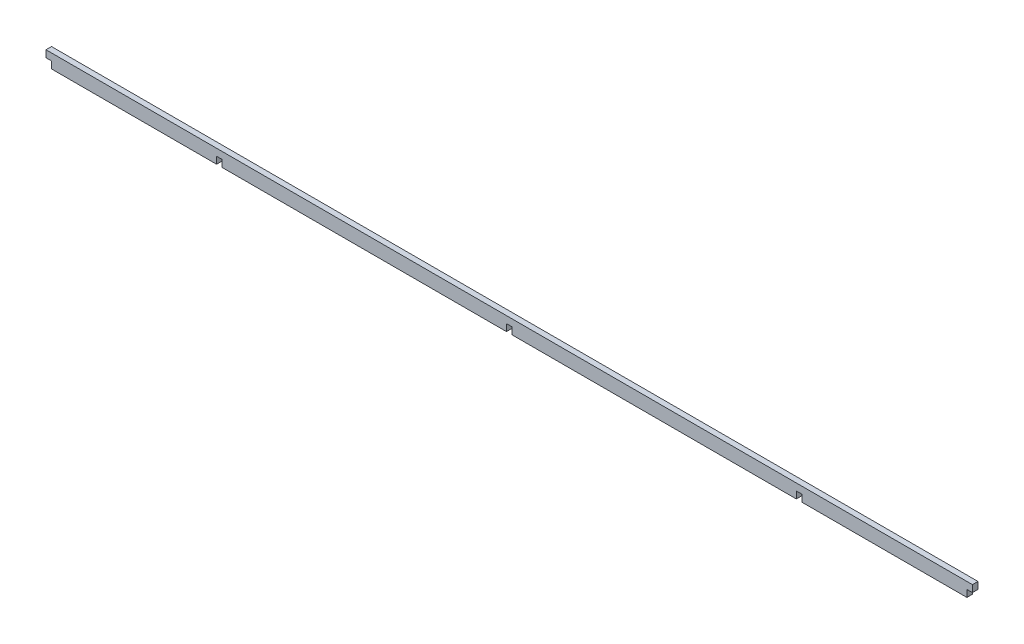
ISO-10303-21;
HEADER;
FILE_DESCRIPTION(('STEP AP214'),'2;1');
FILE_NAME('part.step','',(''),(''),'','','');
FILE_SCHEMA(('AUTOMOTIVE_DESIGN { 1 0 10303 214 1 1 1 1 }'));
ENDSEC;
DATA;
#1=APPLICATION_CONTEXT('core data for automotive mechanical design processes');
#2=APPLICATION_PROTOCOL_DEFINITION('international standard','automotive_design',2000,#1);
#3=PRODUCT_CONTEXT('',#1,'mechanical');
#4=PRODUCT('Part','Part','',(#3));
#5=PRODUCT_RELATED_PRODUCT_CATEGORY('part','',(#4));
#6=PRODUCT_DEFINITION_FORMATION('','',#4);
#7=PRODUCT_DEFINITION_CONTEXT('part definition',#1,'design');
#8=PRODUCT_DEFINITION('design','',#6,#7);
#9=PRODUCT_DEFINITION_SHAPE('','',#8);
#10=(LENGTH_UNIT() NAMED_UNIT(*) SI_UNIT(.MILLI.,.METRE.));
#11=(NAMED_UNIT(*) PLANE_ANGLE_UNIT() SI_UNIT($,.RADIAN.));
#12=(NAMED_UNIT(*) SI_UNIT($,.STERADIAN.) SOLID_ANGLE_UNIT());
#13=UNCERTAINTY_MEASURE_WITH_UNIT(LENGTH_MEASURE(1.E-05),#10,'distance_accuracy_value','');
#14=(GEOMETRIC_REPRESENTATION_CONTEXT(3) GLOBAL_UNCERTAINTY_ASSIGNED_CONTEXT((#13)) GLOBAL_UNIT_ASSIGNED_CONTEXT((#10,
#11,#12)) REPRESENTATION_CONTEXT('',''));
#15=CARTESIAN_POINT('',(0.,0.,0.));
#16=DIRECTION('',(0.,0.,1.));
#17=DIRECTION('',(1.,0.,0.));
#18=AXIS2_PLACEMENT_3D('',#15,#16,#17);
#19=CARTESIAN_POINT('',(825.000000000002,-7.32747196252598E-12,10.));
#20=DIRECTION('',(1.,0.,0.));
#21=DIRECTION('',(0.,1.,0.));
#22=AXIS2_PLACEMENT_3D('',#19,#20,#21);
#23=PLANE('',#22);
#24=DIRECTION('',(0.,-1.,0.));
#25=VECTOR('',#24,1.);
#26=CARTESIAN_POINT('',(825.000000000002,-7.32747196252598E-12,0.));
#27=LINE('',#26,#25);
#28=CARTESIAN_POINT('',(825.000000000002,2.02737259969958E-13,0.));
#29=VERTEX_POINT('',#28);
#30=CARTESIAN_POINT('',(825.000000000002,-12.5,0.));
#31=VERTEX_POINT('',#30);
#32=EDGE_CURVE('E207',#29,#31,#27,.T.);
#33=ORIENTED_EDGE('',*,*,#32,.F.);
#34=DIRECTION('',(0.,0.,-1.));
#35=VECTOR('',#34,1.);
#36=CARTESIAN_POINT('',(825.000000000002,2.02737259969958E-13,10.));
#37=LINE('',#36,#35);
#38=CARTESIAN_POINT('',(825.000000000002,2.02737259969958E-13,10.));
#39=VERTEX_POINT('',#38);
#40=EDGE_CURVE('E11',#39,#29,#37,.T.);
#41=ORIENTED_EDGE('',*,*,#40,.F.);
#42=DIRECTION('',(0.,-1.,0.));
#43=VECTOR('',#42,1.);
#44=CARTESIAN_POINT('',(825.000000000002,-7.32747196252598E-12,10.));
#45=LINE('',#44,#43);
#46=CARTESIAN_POINT('',(825.000000000002,-12.5,10.));
#47=VERTEX_POINT('',#46);
#48=EDGE_CURVE('E315',#39,#47,#45,.T.);
#49=ORIENTED_EDGE('',*,*,#48,.T.);
#50=DIRECTION('',(0.,0.,-1.));
#51=VECTOR('',#50,1.);
#52=CARTESIAN_POINT('',(825.000000000002,-12.5,10.));
#53=LINE('',#52,#51);
#54=EDGE_CURVE('E129',#47,#31,#53,.T.);
#55=ORIENTED_EDGE('',*,*,#54,.T.);
#56=EDGE_LOOP('',(#33,#41,#49,#55));
#57=FACE_BOUND('',#56,.T.);
#58=ADVANCED_FACE('F43',(#57),#23,.T.);
#59=CARTESIAN_POINT('',(0.,0.,10.));
#60=DIRECTION('',(0.,-1.,0.));
#61=DIRECTION('',(1.,0.,0.));
#62=AXIS2_PLACEMENT_3D('',#59,#60,#61);
#63=PLANE('',#62);
#64=DIRECTION('',(-1.,0.,0.));
#65=VECTOR('',#64,1.);
#66=CARTESIAN_POINT('',(0.,0.,0.));
#67=LINE('',#66,#65);
#68=CARTESIAN_POINT('',(835.,2.03626637713783E-13,0.));
#69=VERTEX_POINT('',#68);
#70=EDGE_CURVE('E210',#69,#29,#67,.T.);
#71=ORIENTED_EDGE('',*,*,#70,.F.);
#72=DIRECTION('',(0.,0.,-1.));
#73=VECTOR('',#72,1.);
#74=CARTESIAN_POINT('',(835.,2.03626637713783E-13,10.));
#75=LINE('',#74,#73);
#76=CARTESIAN_POINT('',(835.,2.03626637713783E-13,10.));
#77=VERTEX_POINT('',#76);
#78=EDGE_CURVE('E51',#77,#69,#75,.T.);
#79=ORIENTED_EDGE('',*,*,#78,.F.);
#80=DIRECTION('',(-1.,0.,0.));
#81=VECTOR('',#80,1.);
#82=CARTESIAN_POINT('',(0.,0.,10.));
#83=LINE('',#82,#81);
#84=EDGE_CURVE('E311',#77,#39,#83,.T.);
#85=ORIENTED_EDGE('',*,*,#84,.T.);
#86=ORIENTED_EDGE('',*,*,#40,.T.);
#87=EDGE_LOOP('',(#71,#79,#85,#86));
#88=FACE_BOUND('',#87,.T.);
#89=ADVANCED_FACE('F299',(#88),#63,.T.);
#90=CARTESIAN_POINT('',(835.,0.,10.));
#91=DIRECTION('',(1.,0.,0.));
#92=DIRECTION('',(0.,0.,-1.));
#93=AXIS2_PLACEMENT_3D('',#90,#91,#92);
#94=PLANE('',#93);
#95=DIRECTION('',(0.,-1.,0.));
#96=VECTOR('',#95,1.);
#97=CARTESIAN_POINT('',(835.,0.,0.));
#98=LINE('',#97,#96);
#99=CARTESIAN_POINT('',(835.,12.5,0.));
#100=VERTEX_POINT('',#99);
#101=EDGE_CURVE('E213',#100,#69,#98,.T.);
#102=ORIENTED_EDGE('',*,*,#101,.F.);
#103=DIRECTION('',(0.,0.,-1.));
#104=VECTOR('',#103,1.);
#105=CARTESIAN_POINT('',(835.,12.5,10.));
#106=LINE('',#105,#104);
#107=CARTESIAN_POINT('',(835.,12.5,10.));
#108=VERTEX_POINT('',#107);
#109=EDGE_CURVE('E288',#108,#100,#106,.T.);
#110=ORIENTED_EDGE('',*,*,#109,.F.);
#111=DIRECTION('',(0.,-1.,0.));
#112=VECTOR('',#111,1.);
#113=CARTESIAN_POINT('',(835.,0.,10.));
#114=LINE('',#113,#112);
#115=EDGE_CURVE('E295',#108,#77,#114,.T.);
#116=ORIENTED_EDGE('',*,*,#115,.T.);
#117=ORIENTED_EDGE('',*,*,#78,.T.);
#118=EDGE_LOOP('',(#102,#110,#116,#117));
#119=FACE_BOUND('',#118,.T.);
#120=ADVANCED_FACE('F293',(#119),#94,.T.);
#121=CARTESIAN_POINT('',(0.,12.5,10.));
#122=DIRECTION('',(0.,1.,0.));
#123=DIRECTION('',(0.,0.,1.));
#124=AXIS2_PLACEMENT_3D('',#121,#122,#123);
#125=PLANE('',#124);
#126=DIRECTION('',(1.,0.,0.));
#127=VECTOR('',#126,1.);
#128=CARTESIAN_POINT('',(0.,12.5,0.));
#129=LINE('',#128,#127);
#130=CARTESIAN_POINT('',(-835.,12.5,0.));
#131=VERTEX_POINT('',#130);
#132=EDGE_CURVE('E216',#131,#100,#129,.T.);
#133=ORIENTED_EDGE('',*,*,#132,.F.);
#134=DIRECTION('',(0.,0.,-1.));
#135=VECTOR('',#134,1.);
#136=CARTESIAN_POINT('',(-835.,12.5,10.));
#137=LINE('',#136,#135);
#138=CARTESIAN_POINT('',(-835.,12.5,10.));
#139=VERTEX_POINT('',#138);
#140=EDGE_CURVE('E286',#139,#131,#137,.T.);
#141=ORIENTED_EDGE('',*,*,#140,.F.);
#142=DIRECTION('',(1.,0.,0.));
#143=VECTOR('',#142,1.);
#144=CARTESIAN_POINT('',(0.,12.5,10.));
#145=LINE('',#144,#143);
#146=EDGE_CURVE('E310',#139,#108,#145,.T.);
#147=ORIENTED_EDGE('',*,*,#146,.T.);
#148=ORIENTED_EDGE('',*,*,#109,.T.);
#149=EDGE_LOOP('',(#133,#141,#147,#148));
#150=FACE_BOUND('',#149,.T.);
#151=ADVANCED_FACE('F306',(#150),#125,.T.);
#152=CARTESIAN_POINT('',(-835.,0.,10.));
#153=DIRECTION('',(1.,0.,0.));
#154=DIRECTION('',(0.,0.,-1.));
#155=AXIS2_PLACEMENT_3D('',#152,#153,#154);
#156=PLANE('',#155);
#157=DIRECTION('',(0.,-1.,0.));
#158=VECTOR('',#157,1.);
#159=CARTESIAN_POINT('',(-835.,0.,0.));
#160=LINE('',#159,#158);
#161=CARTESIAN_POINT('',(-835.,0.,0.));
#162=VERTEX_POINT('',#161);
#163=EDGE_CURVE('E219',#131,#162,#160,.T.);
#164=ORIENTED_EDGE('',*,*,#163,.T.);
#165=DIRECTION('',(0.,0.,-1.));
#166=VECTOR('',#165,1.);
#167=CARTESIAN_POINT('',(-835.,0.,10.));
#168=LINE('',#167,#166);
#169=CARTESIAN_POINT('',(-835.,0.,10.));
#170=VERTEX_POINT('',#169);
#171=EDGE_CURVE('E283',#170,#162,#168,.T.);
#172=ORIENTED_EDGE('',*,*,#171,.F.);
#173=DIRECTION('',(0.,-1.,0.));
#174=VECTOR('',#173,1.);
#175=CARTESIAN_POINT('',(-835.,0.,10.));
#176=LINE('',#175,#174);
#177=EDGE_CURVE('E313',#139,#170,#176,.T.);
#178=ORIENTED_EDGE('',*,*,#177,.F.);
#179=ORIENTED_EDGE('',*,*,#140,.T.);
#180=EDGE_LOOP('',(#164,#172,#178,#179));
#181=FACE_BOUND('',#180,.T.);
#182=ADVANCED_FACE('F363',(#181),#156,.F.);
#183=CARTESIAN_POINT('',(0.,0.,10.));
#184=DIRECTION('',(0.,1.,0.));
#185=DIRECTION('',(-1.,0.,0.));
#186=AXIS2_PLACEMENT_3D('',#183,#184,#185);
#187=PLANE('',#186);
#188=DIRECTION('',(1.,0.,0.));
#189=VECTOR('',#188,1.);
#190=CARTESIAN_POINT('',(0.,0.,0.));
#191=LINE('',#190,#189);
#192=CARTESIAN_POINT('',(-825.000000000002,0.,0.));
#193=VERTEX_POINT('',#192);
#194=EDGE_CURVE('E221',#162,#193,#191,.T.);
#195=ORIENTED_EDGE('',*,*,#194,.T.);
#196=DIRECTION('',(0.,0.,-1.));
#197=VECTOR('',#196,1.);
#198=CARTESIAN_POINT('',(-825.000000000002,0.,10.));
#199=LINE('',#198,#197);
#200=CARTESIAN_POINT('',(-825.000000000002,0.,10.));
#201=VERTEX_POINT('',#200);
#202=EDGE_CURVE('E280',#201,#193,#199,.T.);
#203=ORIENTED_EDGE('',*,*,#202,.F.);
#204=DIRECTION('',(1.,0.,0.));
#205=VECTOR('',#204,1.);
#206=CARTESIAN_POINT('',(0.,0.,10.));
#207=LINE('',#206,#205);
#208=EDGE_CURVE('E320',#170,#201,#207,.T.);
#209=ORIENTED_EDGE('',*,*,#208,.F.);
#210=ORIENTED_EDGE('',*,*,#171,.T.);
#211=EDGE_LOOP('',(#195,#203,#209,#210));
#212=FACE_BOUND('',#211,.T.);
#213=ADVANCED_FACE('F366',(#212),#187,.F.);
#214=CARTESIAN_POINT('',(-825.000000000002,-7.32747196252598E-12,10.));
#215=DIRECTION('',(1.,0.,0.));
#216=DIRECTION('',(0.,1.,0.));
#217=AXIS2_PLACEMENT_3D('',#214,#215,#216);
#218=PLANE('',#217);
#219=DIRECTION('',(0.,-1.,0.));
#220=VECTOR('',#219,1.);
#221=CARTESIAN_POINT('',(-825.000000000002,-7.32747196252598E-12,0.));
#222=LINE('',#221,#220);
#223=CARTESIAN_POINT('',(-825.000000000002,-12.5,0.));
#224=VERTEX_POINT('',#223);
#225=EDGE_CURVE('E223',#193,#224,#222,.T.);
#226=ORIENTED_EDGE('',*,*,#225,.T.);
#227=DIRECTION('',(0.,0.,-1.));
#228=VECTOR('',#227,1.);
#229=CARTESIAN_POINT('',(-825.000000000002,-12.5,10.));
#230=LINE('',#229,#228);
#231=CARTESIAN_POINT('',(-825.000000000002,-12.5,10.));
#232=VERTEX_POINT('',#231);
#233=EDGE_CURVE('E277',#232,#224,#230,.T.);
#234=ORIENTED_EDGE('',*,*,#233,.F.);
#235=DIRECTION('',(0.,-1.,0.));
#236=VECTOR('',#235,1.);
#237=CARTESIAN_POINT('',(-825.000000000002,-7.32747196252598E-12,10.));
#238=LINE('',#237,#236);
#239=EDGE_CURVE('E322',#201,#232,#238,.T.);
#240=ORIENTED_EDGE('',*,*,#239,.F.);
#241=ORIENTED_EDGE('',*,*,#202,.T.);
#242=EDGE_LOOP('',(#226,#234,#240,#241));
#243=FACE_BOUND('',#242,.T.);
#244=ADVANCED_FACE('F370',(#243),#218,.F.);
#245=CARTESIAN_POINT('',(0.,-12.5,10.));
#246=DIRECTION('',(0.,1.,0.));
#247=DIRECTION('',(0.,0.,1.));
#248=AXIS2_PLACEMENT_3D('',#245,#246,#247);
#249=PLANE('',#248);
#250=DIRECTION('',(1.,0.,0.));
#251=VECTOR('',#250,1.);
#252=CARTESIAN_POINT('',(0.,-12.5,0.));
#253=LINE('',#252,#251);
#254=CARTESIAN_POINT('',(-527.5,-12.5,0.));
#255=VERTEX_POINT('',#254);
#256=EDGE_CURVE('E225',#224,#255,#253,.T.);
#257=ORIENTED_EDGE('',*,*,#256,.T.);
#258=DIRECTION('',(0.,0.,-1.));
#259=VECTOR('',#258,1.);
#260=CARTESIAN_POINT('',(-527.5,-12.5,10.));
#261=LINE('',#260,#259);
#262=CARTESIAN_POINT('',(-527.5,-12.5,10.));
#263=VERTEX_POINT('',#262);
#264=EDGE_CURVE('E275',#263,#255,#261,.T.);
#265=ORIENTED_EDGE('',*,*,#264,.F.);
#266=DIRECTION('',(1.,0.,0.));
#267=VECTOR('',#266,1.);
#268=CARTESIAN_POINT('',(0.,-12.5,10.));
#269=LINE('',#268,#267);
#270=EDGE_CURVE('E324',#232,#263,#269,.T.);
#271=ORIENTED_EDGE('',*,*,#270,.F.);
#272=ORIENTED_EDGE('',*,*,#233,.T.);
#273=EDGE_LOOP('',(#257,#265,#271,#272));
#274=FACE_BOUND('',#273,.T.);
#275=ADVANCED_FACE('F374',(#274),#249,.F.);
#276=CARTESIAN_POINT('',(-527.5,0.,10.));
#277=DIRECTION('',(1.,0.,0.));
#278=DIRECTION('',(0.,0.,-1.));
#279=AXIS2_PLACEMENT_3D('',#276,#277,#278);
#280=PLANE('',#279);
#281=DIRECTION('',(0.,-1.,0.));
#282=VECTOR('',#281,1.);
#283=CARTESIAN_POINT('',(-527.5,0.,0.));
#284=LINE('',#283,#282);
#285=CARTESIAN_POINT('',(-527.5,0.,0.));
#286=VERTEX_POINT('',#285);
#287=EDGE_CURVE('E228',#286,#255,#284,.T.);
#288=ORIENTED_EDGE('',*,*,#287,.F.);
#289=DIRECTION('',(0.,0.,-1.));
#290=VECTOR('',#289,1.);
#291=CARTESIAN_POINT('',(-527.5,0.,10.));
#292=LINE('',#291,#290);
#293=CARTESIAN_POINT('',(-527.5,0.,10.));
#294=VERTEX_POINT('',#293);
#295=EDGE_CURVE('E273',#294,#286,#292,.T.);
#296=ORIENTED_EDGE('',*,*,#295,.F.);
#297=DIRECTION('',(0.,-1.,0.));
#298=VECTOR('',#297,1.);
#299=CARTESIAN_POINT('',(-527.5,0.,10.));
#300=LINE('',#299,#298);
#301=EDGE_CURVE('E326',#294,#263,#300,.T.);
#302=ORIENTED_EDGE('',*,*,#301,.T.);
#303=ORIENTED_EDGE('',*,*,#264,.T.);
#304=EDGE_LOOP('',(#288,#296,#302,#303));
#305=FACE_BOUND('',#304,.T.);
#306=ADVANCED_FACE('F376',(#305),#280,.T.);
#307=CARTESIAN_POINT('',(0.,0.,10.));
#308=DIRECTION('',(0.,1.,0.));
#309=DIRECTION('',(-1.,0.,0.));
#310=AXIS2_PLACEMENT_3D('',#307,#308,#309);
#311=PLANE('',#310);
#312=DIRECTION('',(1.,0.,0.));
#313=VECTOR('',#312,1.);
#314=CARTESIAN_POINT('',(0.,0.,0.));
#315=LINE('',#314,#313);
#316=CARTESIAN_POINT('',(-517.500000000002,0.,0.));
#317=VERTEX_POINT('',#316);
#318=EDGE_CURVE('E232',#286,#317,#315,.T.);
#319=ORIENTED_EDGE('',*,*,#318,.T.);
#320=DIRECTION('',(0.,0.,-1.));
#321=VECTOR('',#320,1.);
#322=CARTESIAN_POINT('',(-517.500000000002,0.,10.));
#323=LINE('',#322,#321);
#324=CARTESIAN_POINT('',(-517.500000000002,0.,10.));
#325=VERTEX_POINT('',#324);
#326=EDGE_CURVE('E270',#325,#317,#323,.T.);
#327=ORIENTED_EDGE('',*,*,#326,.F.);
#328=DIRECTION('',(1.,0.,0.));
#329=VECTOR('',#328,1.);
#330=CARTESIAN_POINT('',(0.,0.,10.));
#331=LINE('',#330,#329);
#332=EDGE_CURVE('E330',#294,#325,#331,.T.);
#333=ORIENTED_EDGE('',*,*,#332,.F.);
#334=ORIENTED_EDGE('',*,*,#295,.T.);
#335=EDGE_LOOP('',(#319,#327,#333,#334));
#336=FACE_BOUND('',#335,.T.);
#337=ADVANCED_FACE('F379',(#336),#311,.F.);
#338=CARTESIAN_POINT('',(-517.500000000002,-4.59632332194812E-12,10.));
#339=DIRECTION('',(1.,0.,0.));
#340=DIRECTION('',(0.,1.,0.));
#341=AXIS2_PLACEMENT_3D('',#338,#339,#340);
#342=PLANE('',#341);
#343=DIRECTION('',(0.,-1.,0.));
#344=VECTOR('',#343,1.);
#345=CARTESIAN_POINT('',(-517.500000000002,-4.59632332194812E-12,0.));
#346=LINE('',#345,#344);
#347=CARTESIAN_POINT('',(-517.500000000002,-12.5,0.));
#348=VERTEX_POINT('',#347);
#349=EDGE_CURVE('E234',#317,#348,#346,.T.);
#350=ORIENTED_EDGE('',*,*,#349,.T.);
#351=DIRECTION('',(0.,0.,-1.));
#352=VECTOR('',#351,1.);
#353=CARTESIAN_POINT('',(-517.500000000002,-12.5,10.));
#354=LINE('',#353,#352);
#355=CARTESIAN_POINT('',(-517.500000000002,-12.5,10.));
#356=VERTEX_POINT('',#355);
#357=EDGE_CURVE('E267',#356,#348,#354,.T.);
#358=ORIENTED_EDGE('',*,*,#357,.F.);
#359=DIRECTION('',(0.,-1.,0.));
#360=VECTOR('',#359,1.);
#361=CARTESIAN_POINT('',(-517.500000000002,-4.59632332194812E-12,10.));
#362=LINE('',#361,#360);
#363=EDGE_CURVE('E332',#325,#356,#362,.T.);
#364=ORIENTED_EDGE('',*,*,#363,.F.);
#365=ORIENTED_EDGE('',*,*,#326,.T.);
#366=EDGE_LOOP('',(#350,#358,#364,#365));
#367=FACE_BOUND('',#366,.T.);
#368=ADVANCED_FACE('F383',(#367),#342,.F.);
#369=CARTESIAN_POINT('',(-5.,-12.5,0.));
#370=VERTEX_POINT('',#369);
#371=EDGE_CURVE('E229',#348,#370,#253,.T.);
#372=ORIENTED_EDGE('',*,*,#371,.T.);
#373=DIRECTION('',(0.,0.,-1.));
#374=VECTOR('',#373,1.);
#375=CARTESIAN_POINT('',(-5.,-12.5,10.));
#376=LINE('',#375,#374);
#377=CARTESIAN_POINT('',(-5.,-12.5,10.));
#378=VERTEX_POINT('',#377);
#379=EDGE_CURVE('E265',#378,#370,#376,.T.);
#380=ORIENTED_EDGE('',*,*,#379,.F.);
#381=EDGE_CURVE('E327',#356,#378,#269,.T.);
#382=ORIENTED_EDGE('',*,*,#381,.F.);
#383=ORIENTED_EDGE('',*,*,#357,.T.);
#384=EDGE_LOOP('',(#372,#380,#382,#383));
#385=FACE_BOUND('',#384,.T.);
#386=ADVANCED_FACE('F387',(#385),#249,.F.);
#387=CARTESIAN_POINT('',(-5.,0.,10.));
#388=DIRECTION('',(1.,0.,0.));
#389=DIRECTION('',(0.,1.,0.));
#390=AXIS2_PLACEMENT_3D('',#387,#388,#389);
#391=PLANE('',#390);
#392=DIRECTION('',(0.,-1.,0.));
#393=VECTOR('',#392,1.);
#394=CARTESIAN_POINT('',(-5.,0.,0.));
#395=LINE('',#394,#393);
#396=CARTESIAN_POINT('',(-5.,0.,0.));
#397=VERTEX_POINT('',#396);
#398=EDGE_CURVE('E236',#397,#370,#395,.T.);
#399=ORIENTED_EDGE('',*,*,#398,.F.);
#400=DIRECTION('',(0.,0.,-1.));
#401=VECTOR('',#400,1.);
#402=CARTESIAN_POINT('',(-5.,0.,10.));
#403=LINE('',#402,#401);
#404=CARTESIAN_POINT('',(-5.,0.,10.));
#405=VERTEX_POINT('',#404);
#406=EDGE_CURVE('E263',#405,#397,#403,.T.);
#407=ORIENTED_EDGE('',*,*,#406,.F.);
#408=DIRECTION('',(0.,-1.,0.));
#409=VECTOR('',#408,1.);
#410=CARTESIAN_POINT('',(-5.,0.,10.));
#411=LINE('',#410,#409);
#412=EDGE_CURVE('E334',#405,#378,#411,.T.);
#413=ORIENTED_EDGE('',*,*,#412,.T.);
#414=ORIENTED_EDGE('',*,*,#379,.T.);
#415=EDGE_LOOP('',(#399,#407,#413,#414));
#416=FACE_BOUND('',#415,.T.);
#417=ADVANCED_FACE('F391',(#416),#391,.T.);
#418=CARTESIAN_POINT('',(0.,0.,10.));
#419=DIRECTION('',(0.,1.,0.));
#420=DIRECTION('',(-1.,0.,0.));
#421=AXIS2_PLACEMENT_3D('',#418,#419,#420);
#422=PLANE('',#421);
#423=DIRECTION('',(1.,0.,0.));
#424=VECTOR('',#423,1.);
#425=CARTESIAN_POINT('',(0.,0.,0.));
#426=LINE('',#425,#424);
#427=CARTESIAN_POINT('',(5.,0.,0.));
#428=VERTEX_POINT('',#427);
#429=EDGE_CURVE('E239',#397,#428,#426,.T.);
#430=ORIENTED_EDGE('',*,*,#429,.T.);
#431=DIRECTION('',(0.,0.,-1.));
#432=VECTOR('',#431,1.);
#433=CARTESIAN_POINT('',(5.,0.,10.));
#434=LINE('',#433,#432);
#435=CARTESIAN_POINT('',(5.,0.,10.));
#436=VERTEX_POINT('',#435);
#437=EDGE_CURVE('E260',#436,#428,#434,.T.);
#438=ORIENTED_EDGE('',*,*,#437,.F.);
#439=DIRECTION('',(1.,0.,0.));
#440=VECTOR('',#439,1.);
#441=CARTESIAN_POINT('',(0.,0.,10.));
#442=LINE('',#441,#440);
#443=EDGE_CURVE('E337',#405,#436,#442,.T.);
#444=ORIENTED_EDGE('',*,*,#443,.F.);
#445=ORIENTED_EDGE('',*,*,#406,.T.);
#446=EDGE_LOOP('',(#430,#438,#444,#445));
#447=FACE_BOUND('',#446,.T.);
#448=ADVANCED_FACE('F395',(#447),#422,.F.);
#449=CARTESIAN_POINT('',(5.,0.,10.));
#450=DIRECTION('',(1.,0.,0.));
#451=DIRECTION('',(0.,1.,0.));
#452=AXIS2_PLACEMENT_3D('',#449,#450,#451);
#453=PLANE('',#452);
#454=DIRECTION('',(0.,-1.,0.));
#455=VECTOR('',#454,1.);
#456=CARTESIAN_POINT('',(5.,0.,0.));
#457=LINE('',#456,#455);
#458=CARTESIAN_POINT('',(5.,-12.5,0.));
#459=VERTEX_POINT('',#458);
#460=EDGE_CURVE('E241',#428,#459,#457,.T.);
#461=ORIENTED_EDGE('',*,*,#460,.T.);
#462=DIRECTION('',(0.,0.,-1.));
#463=VECTOR('',#462,1.);
#464=CARTESIAN_POINT('',(5.,-12.5,10.));
#465=LINE('',#464,#463);
#466=CARTESIAN_POINT('',(5.,-12.5,10.));
#467=VERTEX_POINT('',#466);
#468=EDGE_CURVE('E257',#467,#459,#465,.T.);
#469=ORIENTED_EDGE('',*,*,#468,.F.);
#470=DIRECTION('',(0.,-1.,0.));
#471=VECTOR('',#470,1.);
#472=CARTESIAN_POINT('',(5.,0.,10.));
#473=LINE('',#472,#471);
#474=EDGE_CURVE('E339',#436,#467,#473,.T.);
#475=ORIENTED_EDGE('',*,*,#474,.F.);
#476=ORIENTED_EDGE('',*,*,#437,.T.);
#477=EDGE_LOOP('',(#461,#469,#475,#476));
#478=FACE_BOUND('',#477,.T.);
#479=ADVANCED_FACE('F399',(#478),#453,.F.);
#480=CARTESIAN_POINT('',(0.,-12.5,10.));
#481=DIRECTION('',(0.,1.,0.));
#482=DIRECTION('',(0.,0.,1.));
#483=AXIS2_PLACEMENT_3D('',#480,#481,#482);
#484=PLANE('',#483);
#485=DIRECTION('',(1.,0.,0.));
#486=VECTOR('',#485,1.);
#487=CARTESIAN_POINT('',(0.,-12.5,0.));
#488=LINE('',#487,#486);
#489=CARTESIAN_POINT('',(517.500000000002,-12.5,0.));
#490=VERTEX_POINT('',#489);
#491=EDGE_CURVE('E243',#459,#490,#488,.T.);
#492=ORIENTED_EDGE('',*,*,#491,.T.);
#493=DIRECTION('',(0.,0.,-1.));
#494=VECTOR('',#493,1.);
#495=CARTESIAN_POINT('',(517.500000000002,-12.5,10.));
#496=LINE('',#495,#494);
#497=CARTESIAN_POINT('',(517.500000000002,-12.5,10.));
#498=VERTEX_POINT('',#497);
#499=EDGE_CURVE('E255',#498,#490,#496,.T.);
#500=ORIENTED_EDGE('',*,*,#499,.F.);
#501=DIRECTION('',(1.,0.,0.));
#502=VECTOR('',#501,1.);
#503=CARTESIAN_POINT('',(0.,-12.5,10.));
#504=LINE('',#503,#502);
#505=EDGE_CURVE('E203',#467,#498,#504,.T.);
#506=ORIENTED_EDGE('',*,*,#505,.F.);
#507=ORIENTED_EDGE('',*,*,#468,.T.);
#508=EDGE_LOOP('',(#492,#500,#506,#507));
#509=FACE_BOUND('',#508,.T.);
#510=ADVANCED_FACE('F345',(#509),#484,.F.);
#511=CARTESIAN_POINT('',(517.500000000002,-4.59632332194812E-12,10.));
#512=DIRECTION('',(1.,0.,0.));
#513=DIRECTION('',(0.,1.,0.));
#514=AXIS2_PLACEMENT_3D('',#511,#512,#513);
#515=PLANE('',#514);
#516=DIRECTION('',(0.,-1.,0.));
#517=VECTOR('',#516,1.);
#518=CARTESIAN_POINT('',(517.500000000002,-4.59632332194812E-12,0.));
#519=LINE('',#518,#517);
#520=CARTESIAN_POINT('',(517.500000000002,1.27421481822396E-13,0.));
#521=VERTEX_POINT('',#520);
#522=EDGE_CURVE('E246',#521,#490,#519,.T.);
#523=ORIENTED_EDGE('',*,*,#522,.F.);
#524=DIRECTION('',(0.,0.,-1.));
#525=VECTOR('',#524,1.);
#526=CARTESIAN_POINT('',(517.500000000002,1.27421481822396E-13,10.));
#527=LINE('',#526,#525);
#528=CARTESIAN_POINT('',(517.500000000002,1.27421481822396E-13,10.));
#529=VERTEX_POINT('',#528);
#530=EDGE_CURVE('E192',#529,#521,#527,.T.);
#531=ORIENTED_EDGE('',*,*,#530,.F.);
#532=DIRECTION('',(0.,-1.,0.));
#533=VECTOR('',#532,1.);
#534=CARTESIAN_POINT('',(517.500000000002,-4.59632332194812E-12,10.));
#535=LINE('',#534,#533);
#536=EDGE_CURVE('E201',#529,#498,#535,.T.);
#537=ORIENTED_EDGE('',*,*,#536,.T.);
#538=ORIENTED_EDGE('',*,*,#499,.T.);
#539=EDGE_LOOP('',(#523,#531,#537,#538));
#540=FACE_BOUND('',#539,.T.);
#541=ADVANCED_FACE('F349',(#540),#515,.T.);
#542=CARTESIAN_POINT('',(0.,0.,10.));
#543=DIRECTION('',(0.,-1.,0.));
#544=DIRECTION('',(1.,0.,0.));
#545=AXIS2_PLACEMENT_3D('',#542,#543,#544);
#546=PLANE('',#545);
#547=DIRECTION('',(-1.,0.,0.));
#548=VECTOR('',#547,1.);
#549=CARTESIAN_POINT('',(0.,0.,0.));
#550=LINE('',#549,#548);
#551=CARTESIAN_POINT('',(527.5,1.29200238315524E-13,0.));
#552=VERTEX_POINT('',#551);
#553=EDGE_CURVE('E191',#552,#521,#550,.T.);
#554=ORIENTED_EDGE('',*,*,#553,.F.);
#555=DIRECTION('',(0.,0.,-1.));
#556=VECTOR('',#555,1.);
#557=CARTESIAN_POINT('',(527.5,1.29200238315524E-13,10.));
#558=LINE('',#557,#556);
#559=CARTESIAN_POINT('',(527.5,1.29200238315524E-13,10.));
#560=VERTEX_POINT('',#559);
#561=EDGE_CURVE('E185',#560,#552,#558,.T.);
#562=ORIENTED_EDGE('',*,*,#561,.F.);
#563=DIRECTION('',(-1.,0.,0.));
#564=VECTOR('',#563,1.);
#565=CARTESIAN_POINT('',(0.,0.,10.));
#566=LINE('',#565,#564);
#567=EDGE_CURVE('E189',#560,#529,#566,.T.);
#568=ORIENTED_EDGE('',*,*,#567,.T.);
#569=ORIENTED_EDGE('',*,*,#530,.T.);
#570=EDGE_LOOP('',(#554,#562,#568,#569));
#571=FACE_BOUND('',#570,.T.);
#572=ADVANCED_FACE('F187',(#571),#546,.T.);
#573=CARTESIAN_POINT('',(527.5,0.,10.));
#574=DIRECTION('',(1.,0.,0.));
#575=DIRECTION('',(0.,0.,-1.));
#576=AXIS2_PLACEMENT_3D('',#573,#574,#575);
#577=PLANE('',#576);
#578=DIRECTION('',(0.,-1.,0.));
#579=VECTOR('',#578,1.);
#580=CARTESIAN_POINT('',(527.5,0.,0.));
#581=LINE('',#580,#579);
#582=CARTESIAN_POINT('',(527.5,-12.5,0.));
#583=VERTEX_POINT('',#582);
#584=EDGE_CURVE('E122',#552,#583,#581,.T.);
#585=ORIENTED_EDGE('',*,*,#584,.T.);
#586=DIRECTION('',(0.,0.,-1.));
#587=VECTOR('',#586,1.);
#588=CARTESIAN_POINT('',(527.5,-12.5,10.));
#589=LINE('',#588,#587);
#590=CARTESIAN_POINT('',(527.5,-12.5,10.));
#591=VERTEX_POINT('',#590);
#592=EDGE_CURVE('E193',#591,#583,#589,.T.);
#593=ORIENTED_EDGE('',*,*,#592,.F.);
#594=DIRECTION('',(0.,-1.,0.));
#595=VECTOR('',#594,1.);
#596=CARTESIAN_POINT('',(527.5,0.,10.));
#597=LINE('',#596,#595);
#598=EDGE_CURVE('E195',#560,#591,#597,.T.);
#599=ORIENTED_EDGE('',*,*,#598,.F.);
#600=ORIENTED_EDGE('',*,*,#561,.T.);
#601=EDGE_LOOP('',(#585,#593,#599,#600));
#602=FACE_BOUND('',#601,.T.);
#603=ADVANCED_FACE('F196',(#602),#577,.F.);
#604=EDGE_CURVE('E247',#583,#31,#488,.T.);
#605=ORIENTED_EDGE('',*,*,#604,.T.);
#606=ORIENTED_EDGE('',*,*,#54,.F.);
#607=EDGE_CURVE('E59',#591,#47,#504,.T.);
#608=ORIENTED_EDGE('',*,*,#607,.F.);
#609=ORIENTED_EDGE('',*,*,#592,.T.);
#610=EDGE_LOOP('',(#605,#606,#608,#609));
#611=FACE_BOUND('',#610,.T.);
#612=ADVANCED_FACE('F410',(#611),#484,.F.);
#613=CARTESIAN_POINT('',(0.,0.,10.));
#614=DIRECTION('',(0.,0.,1.));
#615=DIRECTION('',(1.,0.,0.));
#616=AXIS2_PLACEMENT_3D('',#613,#614,#615);
#617=PLANE('',#616);
#618=ORIENTED_EDGE('',*,*,#48,.F.);
#619=ORIENTED_EDGE('',*,*,#84,.F.);
#620=ORIENTED_EDGE('',*,*,#115,.F.);
#621=ORIENTED_EDGE('',*,*,#146,.F.);
#622=ORIENTED_EDGE('',*,*,#177,.T.);
#623=ORIENTED_EDGE('',*,*,#208,.T.);
#624=ORIENTED_EDGE('',*,*,#239,.T.);
#625=ORIENTED_EDGE('',*,*,#270,.T.);
#626=ORIENTED_EDGE('',*,*,#301,.F.);
#627=ORIENTED_EDGE('',*,*,#332,.T.);
#628=ORIENTED_EDGE('',*,*,#363,.T.);
#629=ORIENTED_EDGE('',*,*,#381,.T.);
#630=ORIENTED_EDGE('',*,*,#412,.F.);
#631=ORIENTED_EDGE('',*,*,#443,.T.);
#632=ORIENTED_EDGE('',*,*,#474,.T.);
#633=ORIENTED_EDGE('',*,*,#505,.T.);
#634=ORIENTED_EDGE('',*,*,#536,.F.);
#635=ORIENTED_EDGE('',*,*,#567,.F.);
#636=ORIENTED_EDGE('',*,*,#598,.T.);
#637=ORIENTED_EDGE('',*,*,#607,.T.);
#638=EDGE_LOOP('',(#618,#619,#620,#621,#622,#623,#624,#625,#626,#627,#628,#629,#630,#631,#632,
#633,#634,#635,#636,#637));
#639=FACE_BOUND('',#638,.T.);
#640=ADVANCED_FACE('F199',(#639),#617,.T.);
#641=CARTESIAN_POINT('',(0.,0.,0.));
#642=DIRECTION('',(0.,0.,1.));
#643=DIRECTION('',(1.,0.,0.));
#644=AXIS2_PLACEMENT_3D('',#641,#642,#643);
#645=PLANE('',#644);
#646=ORIENTED_EDGE('',*,*,#32,.T.);
#647=ORIENTED_EDGE('',*,*,#604,.F.);
#648=ORIENTED_EDGE('',*,*,#584,.F.);
#649=ORIENTED_EDGE('',*,*,#553,.T.);
#650=ORIENTED_EDGE('',*,*,#522,.T.);
#651=ORIENTED_EDGE('',*,*,#491,.F.);
#652=ORIENTED_EDGE('',*,*,#460,.F.);
#653=ORIENTED_EDGE('',*,*,#429,.F.);
#654=ORIENTED_EDGE('',*,*,#398,.T.);
#655=ORIENTED_EDGE('',*,*,#371,.F.);
#656=ORIENTED_EDGE('',*,*,#349,.F.);
#657=ORIENTED_EDGE('',*,*,#318,.F.);
#658=ORIENTED_EDGE('',*,*,#287,.T.);
#659=ORIENTED_EDGE('',*,*,#256,.F.);
#660=ORIENTED_EDGE('',*,*,#225,.F.);
#661=ORIENTED_EDGE('',*,*,#194,.F.);
#662=ORIENTED_EDGE('',*,*,#163,.F.);
#663=ORIENTED_EDGE('',*,*,#132,.T.);
#664=ORIENTED_EDGE('',*,*,#101,.T.);
#665=ORIENTED_EDGE('',*,*,#70,.T.);
#666=EDGE_LOOP('',(#646,#647,#648,#649,#650,#651,#652,#653,#654,#655,#656,#657,#658,#659,#660,
#661,#662,#663,#664,#665));
#667=FACE_BOUND('',#666,.T.);
#668=ADVANCED_FACE('F301',(#667),#645,.F.);
#669=CLOSED_SHELL('',(#58,#89,#120,#151,#182,#213,#244,#275,#306,#337,#368,#386,#417,#448,#479,
#510,#541,#572,#603,#612,#640,#668));
#670=MANIFOLD_SOLID_BREP('B2',#669);
#671=ADVANCED_BREP_SHAPE_REPRESENTATION('',(#18,#670),#14);
#672=SHAPE_DEFINITION_REPRESENTATION(#9,#671);
ENDSEC;
END-ISO-10303-21;
